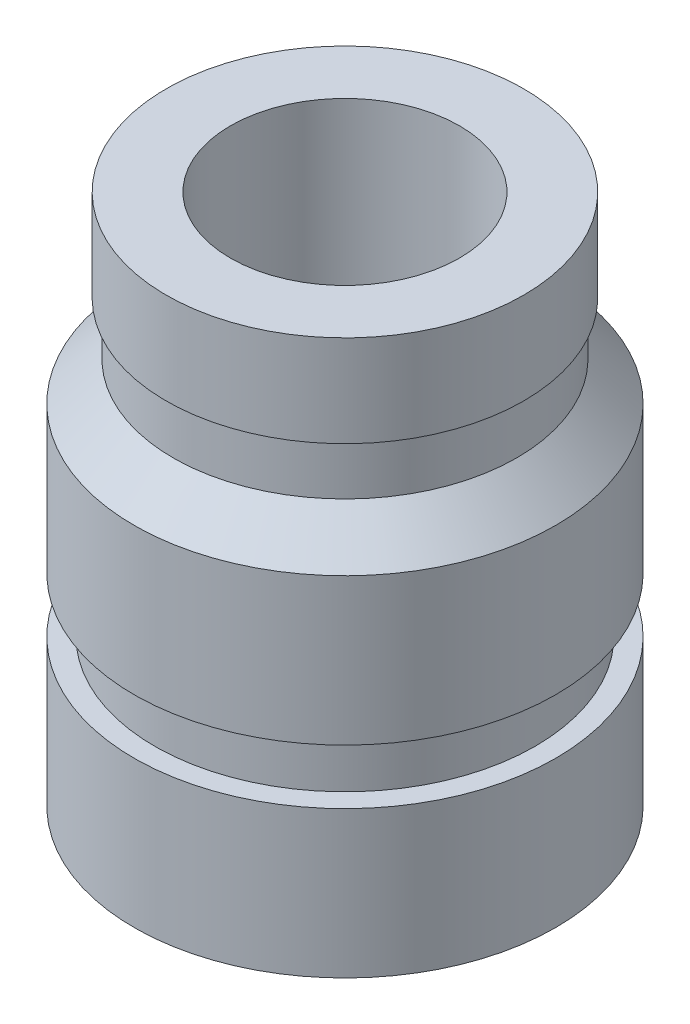
ISO-10303-21;
HEADER;
FILE_DESCRIPTION(('STEP AP214'),'2;1');
FILE_NAME('part.step','',(''),(''),'','','');
FILE_SCHEMA(('AUTOMOTIVE_DESIGN { 1 0 10303 214 1 1 1 1 }'));
ENDSEC;
DATA;
#1=APPLICATION_CONTEXT('core data for automotive mechanical design processes');
#2=APPLICATION_PROTOCOL_DEFINITION('international standard','automotive_design',2000,#1);
#3=PRODUCT_CONTEXT('',#1,'mechanical');
#4=PRODUCT('Part','Part','',(#3));
#5=PRODUCT_RELATED_PRODUCT_CATEGORY('part','',(#4));
#6=PRODUCT_DEFINITION_FORMATION('','',#4);
#7=PRODUCT_DEFINITION_CONTEXT('part definition',#1,'design');
#8=PRODUCT_DEFINITION('design','',#6,#7);
#9=PRODUCT_DEFINITION_SHAPE('','',#8);
#10=(LENGTH_UNIT() NAMED_UNIT(*) SI_UNIT(.MILLI.,.METRE.));
#11=(NAMED_UNIT(*) PLANE_ANGLE_UNIT() SI_UNIT($,.RADIAN.));
#12=(NAMED_UNIT(*) SI_UNIT($,.STERADIAN.) SOLID_ANGLE_UNIT());
#13=UNCERTAINTY_MEASURE_WITH_UNIT(LENGTH_MEASURE(1.E-05),#10,'distance_accuracy_value','');
#14=(GEOMETRIC_REPRESENTATION_CONTEXT(3) GLOBAL_UNCERTAINTY_ASSIGNED_CONTEXT((#13)) GLOBAL_UNIT_ASSIGNED_CONTEXT((#10,
#11,#12)) REPRESENTATION_CONTEXT('',''));
#15=CARTESIAN_POINT('',(0.,0.,0.));
#16=DIRECTION('',(0.,0.,1.));
#17=DIRECTION('',(1.,0.,0.));
#18=AXIS2_PLACEMENT_3D('',#15,#16,#17);
#19=CARTESIAN_POINT('',(0.,0.,0.));
#20=DIRECTION('',(0.,1.,0.));
#21=DIRECTION('',(-1.,0.,0.));
#22=AXIS2_PLACEMENT_3D('',#19,#20,#21);
#23=PLANE('',#22);
#24=CARTESIAN_POINT('',(0.,0.,0.));
#25=DIRECTION('',(0.,1.,0.));
#26=DIRECTION('',(-1.,0.,0.));
#27=AXIS2_PLACEMENT_3D('',#24,#25,#26);
#28=CIRCLE('',#27,1.25);
#29=CARTESIAN_POINT('',(-1.25,0.,0.));
#30=VERTEX_POINT('',#29);
#31=EDGE_CURVE('E74',#30,#30,#28,.T.);
#32=ORIENTED_EDGE('',*,*,#31,.T.);
#33=EDGE_LOOP('',(#32));
#34=FACE_BOUND('',#33,.T.);
#35=CARTESIAN_POINT('',(0.,0.,0.));
#36=DIRECTION('',(0.,-1.,0.));
#37=DIRECTION('',(1.,0.,0.));
#38=AXIS2_PLACEMENT_3D('',#35,#36,#37);
#39=CIRCLE('',#38,2.3);
#40=CARTESIAN_POINT('',(2.3,0.,0.));
#41=VERTEX_POINT('',#40);
#42=EDGE_CURVE('E10',#41,#41,#39,.T.);
#43=ORIENTED_EDGE('',*,*,#42,.T.);
#44=EDGE_LOOP('',(#43));
#45=FACE_BOUND('',#44,.T.);
#46=ADVANCED_FACE('F37',(#34,#45),#23,.F.);
#47=CARTESIAN_POINT('',(2.25139658474996E-13,-65.6336197600019,0.));
#48=DIRECTION('',(0.,-1.,0.));
#49=DIRECTION('',(1.,0.,0.));
#50=AXIS2_PLACEMENT_3D('',#47,#48,#49);
#51=CYLINDRICAL_SURFACE('',#50,2.3);
#52=ORIENTED_EDGE('',*,*,#42,.F.);
#53=EDGE_LOOP('',(#52));
#54=FACE_BOUND('',#53,.T.);
#55=CARTESIAN_POINT('',(0.,1.60000000000002,0.));
#56=DIRECTION('',(0.,-1.,0.));
#57=DIRECTION('',(1.,0.,0.));
#58=AXIS2_PLACEMENT_3D('',#55,#56,#57);
#59=CIRCLE('',#58,2.29999999999999);
#60=CARTESIAN_POINT('',(2.29999999999999,1.60000000000003,0.));
#61=VERTEX_POINT('',#60);
#62=EDGE_CURVE('E43',#61,#61,#59,.T.);
#63=ORIENTED_EDGE('',*,*,#62,.T.);
#64=EDGE_LOOP('',(#63));
#65=FACE_BOUND('',#64,.T.);
#66=ADVANCED_FACE('F107',(#54,#65),#51,.T.);
#67=CARTESIAN_POINT('',(-2.3,1.6,0.));
#68=DIRECTION('',(0.,-1.,0.));
#69=DIRECTION('',(1.,0.,0.));
#70=AXIS2_PLACEMENT_3D('',#67,#68,#69);
#71=PLANE('',#70);
#72=ORIENTED_EDGE('',*,*,#62,.F.);
#73=EDGE_LOOP('',(#72));
#74=FACE_BOUND('',#73,.T.);
#75=CARTESIAN_POINT('',(0.,1.60000000000002,0.));
#76=DIRECTION('',(0.,-1.,0.));
#77=DIRECTION('',(1.,0.,0.));
#78=AXIS2_PLACEMENT_3D('',#75,#76,#77);
#79=CIRCLE('',#78,2.07499999999999);
#80=CARTESIAN_POINT('',(2.07499999999999,1.60000000000003,0.));
#81=VERTEX_POINT('',#80);
#82=EDGE_CURVE('E47',#81,#81,#79,.T.);
#83=ORIENTED_EDGE('',*,*,#82,.T.);
#84=EDGE_LOOP('',(#83));
#85=FACE_BOUND('',#84,.T.);
#86=ADVANCED_FACE('F111',(#74,#85),#71,.F.);
#87=CARTESIAN_POINT('',(2.25139658474996E-13,-65.6336197600019,0.));
#88=DIRECTION('',(0.,-1.,0.));
#89=DIRECTION('',(1.,0.,0.));
#90=AXIS2_PLACEMENT_3D('',#87,#88,#89);
#91=CYLINDRICAL_SURFACE('',#90,2.07499999999999);
#92=ORIENTED_EDGE('',*,*,#82,.F.);
#93=EDGE_LOOP('',(#92));
#94=FACE_BOUND('',#93,.T.);
#95=CARTESIAN_POINT('',(0.,2.20000000000001,0.));
#96=DIRECTION('',(0.,-1.,0.));
#97=DIRECTION('',(1.,0.,0.));
#98=AXIS2_PLACEMENT_3D('',#95,#96,#97);
#99=CIRCLE('',#98,2.07499999999999);
#100=CARTESIAN_POINT('',(2.07499999999998,2.20000000000001,0.));
#101=VERTEX_POINT('',#100);
#102=EDGE_CURVE('E51',#101,#101,#99,.T.);
#103=ORIENTED_EDGE('',*,*,#102,.T.);
#104=EDGE_LOOP('',(#103));
#105=FACE_BOUND('',#104,.T.);
#106=ADVANCED_FACE('F116',(#94,#105),#91,.T.);
#107=CARTESIAN_POINT('',(-2.075,2.2,0.));
#108=DIRECTION('',(0.,1.,0.));
#109=DIRECTION('',(-1.,0.,0.));
#110=AXIS2_PLACEMENT_3D('',#107,#108,#109);
#111=PLANE('',#110);
#112=ORIENTED_EDGE('',*,*,#102,.F.);
#113=EDGE_LOOP('',(#112));
#114=FACE_BOUND('',#113,.T.);
#115=CARTESIAN_POINT('',(0.,2.20000000000001,0.));
#116=DIRECTION('',(0.,-1.,0.));
#117=DIRECTION('',(1.,0.,0.));
#118=AXIS2_PLACEMENT_3D('',#115,#116,#117);
#119=CIRCLE('',#118,2.29999999999999);
#120=CARTESIAN_POINT('',(2.29999999999998,2.20000000000002,0.));
#121=VERTEX_POINT('',#120);
#122=EDGE_CURVE('E56',#121,#121,#119,.T.);
#123=ORIENTED_EDGE('',*,*,#122,.T.);
#124=EDGE_LOOP('',(#123));
#125=FACE_BOUND('',#124,.T.);
#126=ADVANCED_FACE('F122',(#114,#125),#111,.F.);
#127=CARTESIAN_POINT('',(2.25139658474996E-13,-65.6336197600019,0.));
#128=DIRECTION('',(0.,-1.,0.));
#129=DIRECTION('',(1.,0.,0.));
#130=AXIS2_PLACEMENT_3D('',#127,#128,#129);
#131=CYLINDRICAL_SURFACE('',#130,2.29999999999999);
#132=ORIENTED_EDGE('',*,*,#122,.F.);
#133=EDGE_LOOP('',(#132));
#134=FACE_BOUND('',#133,.T.);
#135=CARTESIAN_POINT('',(0.,3.80000000000001,0.));
#136=DIRECTION('',(0.,-1.,0.));
#137=DIRECTION('',(1.,0.,0.));
#138=AXIS2_PLACEMENT_3D('',#135,#136,#137);
#139=CIRCLE('',#138,2.29999999999999);
#140=CARTESIAN_POINT('',(2.29999999999997,3.80000000000002,0.));
#141=VERTEX_POINT('',#140);
#142=EDGE_CURVE('E59',#141,#141,#139,.T.);
#143=ORIENTED_EDGE('',*,*,#142,.T.);
#144=EDGE_LOOP('',(#143));
#145=FACE_BOUND('',#144,.T.);
#146=ADVANCED_FACE('F126',(#134,#145),#131,.T.);
#147=CARTESIAN_POINT('',(0.,4.22500000000001,0.));
#148=DIRECTION('',(0.,-1.,0.));
#149=DIRECTION('',(1.,0.,0.));
#150=AXIS2_PLACEMENT_3D('',#147,#148,#149);
#151=CONICAL_SURFACE('',#150,1.87499999999999,0.785398163397456);
#152=ORIENTED_EDGE('',*,*,#142,.F.);
#153=EDGE_LOOP('',(#152));
#154=FACE_BOUND('',#153,.T.);
#155=CARTESIAN_POINT('',(0.,4.22500000000001,0.));
#156=DIRECTION('',(0.,-1.,0.));
#157=DIRECTION('',(1.,0.,0.));
#158=AXIS2_PLACEMENT_3D('',#155,#156,#157);
#159=CIRCLE('',#158,1.87499999999999);
#160=CARTESIAN_POINT('',(1.87499999999997,4.22500000000001,0.));
#161=VERTEX_POINT('',#160);
#162=EDGE_CURVE('E62',#161,#161,#159,.T.);
#163=ORIENTED_EDGE('',*,*,#162,.T.);
#164=EDGE_LOOP('',(#163));
#165=FACE_BOUND('',#164,.T.);
#166=ADVANCED_FACE('F130',(#154,#165),#151,.T.);
#167=CARTESIAN_POINT('',(2.25139658474996E-13,-65.6336197600019,0.));
#168=DIRECTION('',(0.,-1.,0.));
#169=DIRECTION('',(1.,0.,0.));
#170=AXIS2_PLACEMENT_3D('',#167,#168,#169);
#171=CYLINDRICAL_SURFACE('',#170,1.87499999999998);
#172=ORIENTED_EDGE('',*,*,#162,.F.);
#173=EDGE_LOOP('',(#172));
#174=FACE_BOUND('',#173,.T.);
#175=CARTESIAN_POINT('',(0.,4.8,0.));
#176=DIRECTION('',(0.,-1.,0.));
#177=DIRECTION('',(1.,0.,0.));
#178=AXIS2_PLACEMENT_3D('',#175,#176,#177);
#179=CIRCLE('',#178,1.87499999999998);
#180=CARTESIAN_POINT('',(1.87499999999997,4.80000000000001,0.));
#181=VERTEX_POINT('',#180);
#182=EDGE_CURVE('E65',#181,#181,#179,.T.);
#183=ORIENTED_EDGE('',*,*,#182,.T.);
#184=EDGE_LOOP('',(#183));
#185=FACE_BOUND('',#184,.T.);
#186=ADVANCED_FACE('F103',(#174,#185),#171,.T.);
#187=CARTESIAN_POINT('',(-1.875,4.8,0.));
#188=DIRECTION('',(0.,1.,0.));
#189=DIRECTION('',(-1.,0.,0.));
#190=AXIS2_PLACEMENT_3D('',#187,#188,#189);
#191=PLANE('',#190);
#192=ORIENTED_EDGE('',*,*,#182,.F.);
#193=EDGE_LOOP('',(#192));
#194=FACE_BOUND('',#193,.T.);
#195=CARTESIAN_POINT('',(0.,4.8,0.));
#196=DIRECTION('',(0.,-1.,0.));
#197=DIRECTION('',(1.,0.,0.));
#198=AXIS2_PLACEMENT_3D('',#195,#196,#197);
#199=CIRCLE('',#198,1.94999999999998);
#200=CARTESIAN_POINT('',(1.94999999999997,4.80000000000001,0.));
#201=VERTEX_POINT('',#200);
#202=EDGE_CURVE('E68',#201,#201,#199,.T.);
#203=ORIENTED_EDGE('',*,*,#202,.T.);
#204=EDGE_LOOP('',(#203));
#205=FACE_BOUND('',#204,.T.);
#206=ADVANCED_FACE('F96',(#194,#205),#191,.F.);
#207=CARTESIAN_POINT('',(2.25139658474996E-13,-65.6336197600019,0.));
#208=DIRECTION('',(0.,-1.,0.));
#209=DIRECTION('',(1.,0.,0.));
#210=AXIS2_PLACEMENT_3D('',#207,#208,#209);
#211=CYLINDRICAL_SURFACE('',#210,1.94999999999998);
#212=ORIENTED_EDGE('',*,*,#202,.F.);
#213=EDGE_LOOP('',(#212));
#214=FACE_BOUND('',#213,.T.);
#215=CARTESIAN_POINT('',(0.,5.8,0.));
#216=DIRECTION('',(0.,-1.,0.));
#217=DIRECTION('',(1.,0.,0.));
#218=AXIS2_PLACEMENT_3D('',#215,#216,#217);
#219=CIRCLE('',#218,1.94999999999998);
#220=CARTESIAN_POINT('',(1.94999999999996,5.80000000000001,0.));
#221=VERTEX_POINT('',#220);
#222=EDGE_CURVE('E71',#221,#221,#219,.T.);
#223=ORIENTED_EDGE('',*,*,#222,.T.);
#224=EDGE_LOOP('',(#223));
#225=FACE_BOUND('',#224,.T.);
#226=ADVANCED_FACE('F91',(#214,#225),#211,.T.);
#227=CARTESIAN_POINT('',(-1.95,5.8,0.));
#228=DIRECTION('',(0.,-1.,0.));
#229=DIRECTION('',(1.,0.,0.));
#230=AXIS2_PLACEMENT_3D('',#227,#228,#229);
#231=PLANE('',#230);
#232=CARTESIAN_POINT('',(0.,5.8,0.));
#233=DIRECTION('',(0.,1.,0.));
#234=DIRECTION('',(-1.,0.,0.));
#235=AXIS2_PLACEMENT_3D('',#232,#233,#234);
#236=CIRCLE('',#235,1.25);
#237=CARTESIAN_POINT('',(-1.25000000000002,5.8,0.));
#238=VERTEX_POINT('',#237);
#239=EDGE_CURVE('E75',#238,#238,#236,.T.);
#240=ORIENTED_EDGE('',*,*,#239,.F.);
#241=EDGE_LOOP('',(#240));
#242=FACE_BOUND('',#241,.T.);
#243=ORIENTED_EDGE('',*,*,#222,.F.);
#244=EDGE_LOOP('',(#243));
#245=FACE_BOUND('',#244,.T.);
#246=ADVANCED_FACE('F85',(#242,#245),#231,.F.);
#247=CARTESIAN_POINT('',(0.,0.,0.));
#248=DIRECTION('',(0.,1.,0.));
#249=DIRECTION('',(-1.,0.,0.));
#250=AXIS2_PLACEMENT_3D('',#247,#248,#249);
#251=CYLINDRICAL_SURFACE('',#250,1.25);
#252=ORIENTED_EDGE('',*,*,#31,.F.);
#253=EDGE_LOOP('',(#252));
#254=FACE_BOUND('',#253,.T.);
#255=ORIENTED_EDGE('',*,*,#239,.T.);
#256=EDGE_LOOP('',(#255));
#257=FACE_BOUND('',#256,.T.);
#258=ADVANCED_FACE('F82',(#254,#257),#251,.F.);
#259=CLOSED_SHELL('',(#46,#66,#86,#106,#126,#146,#166,#186,#206,#226,#246,#258));
#260=MANIFOLD_SOLID_BREP('B2',#259);
#261=ADVANCED_BREP_SHAPE_REPRESENTATION('',(#18,#260),#14);
#262=SHAPE_DEFINITION_REPRESENTATION(#9,#261);
ENDSEC;
END-ISO-10303-21;
